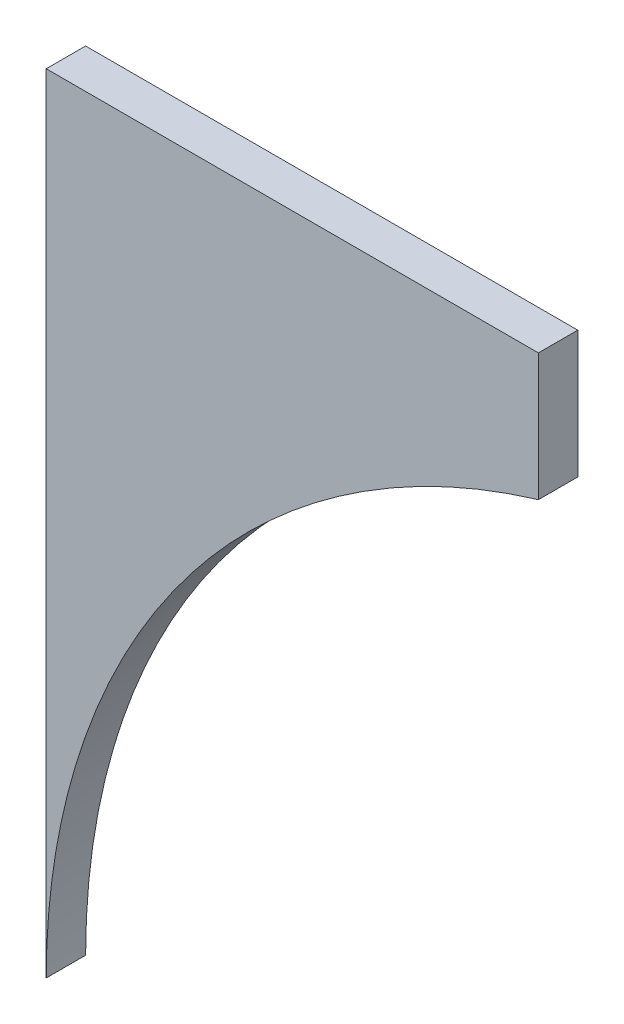
ISO-10303-21;
HEADER;
FILE_DESCRIPTION(('STEP AP214'),'2;1');
FILE_NAME('part.step','',(''),(''),'','','');
FILE_SCHEMA(('AUTOMOTIVE_DESIGN { 1 0 10303 214 1 1 1 1 }'));
ENDSEC;
DATA;
#1=APPLICATION_CONTEXT('core data for automotive mechanical design processes');
#2=APPLICATION_PROTOCOL_DEFINITION('international standard','automotive_design',2000,#1);
#3=PRODUCT_CONTEXT('',#1,'mechanical');
#4=PRODUCT('Part','Part','',(#3));
#5=PRODUCT_RELATED_PRODUCT_CATEGORY('part','',(#4));
#6=PRODUCT_DEFINITION_FORMATION('','',#4);
#7=PRODUCT_DEFINITION_CONTEXT('part definition',#1,'design');
#8=PRODUCT_DEFINITION('design','',#6,#7);
#9=PRODUCT_DEFINITION_SHAPE('','',#8);
#10=(LENGTH_UNIT() NAMED_UNIT(*) SI_UNIT(.MILLI.,.METRE.));
#11=(NAMED_UNIT(*) PLANE_ANGLE_UNIT() SI_UNIT($,.RADIAN.));
#12=(NAMED_UNIT(*) SI_UNIT($,.STERADIAN.) SOLID_ANGLE_UNIT());
#13=UNCERTAINTY_MEASURE_WITH_UNIT(LENGTH_MEASURE(1.E-05),#10,'distance_accuracy_value','');
#14=(GEOMETRIC_REPRESENTATION_CONTEXT(3) GLOBAL_UNCERTAINTY_ASSIGNED_CONTEXT((#13)) GLOBAL_UNIT_ASSIGNED_CONTEXT((#10,
#11,#12)) REPRESENTATION_CONTEXT('',''));
#15=CARTESIAN_POINT('',(0.,0.,0.));
#16=DIRECTION('',(0.,0.,1.));
#17=DIRECTION('',(1.,0.,0.));
#18=AXIS2_PLACEMENT_3D('',#15,#16,#17);
#19=CARTESIAN_POINT('',(2.09999999961,9.36458980412,0.3));
#20=DIRECTION('',(-1.,0.,0.));
#21=DIRECTION('',(0.,-1.,0.));
#22=AXIS2_PLACEMENT_3D('',#19,#20,#21);
#23=PLANE('',#22);
#24=DIRECTION('',(0.,0.,1.));
#25=VECTOR('',#24,1.);
#26=CARTESIAN_POINT('',(2.09999999961,10.0354101974,0.31));
#27=LINE('',#26,#25);
#28=CARTESIAN_POINT('',(2.09999999961,10.0354101974,0.3));
#29=VERTEX_POINT('',#28);
#30=CARTESIAN_POINT('',(2.09999999961,10.0354101974,0.32));
#31=VERTEX_POINT('',#30);
#32=EDGE_CURVE('E11',#29,#31,#27,.T.);
#33=ORIENTED_EDGE('',*,*,#32,.F.);
#34=DIRECTION('',(0.,-1.,0.));
#35=VECTOR('',#34,1.);
#36=CARTESIAN_POINT('',(2.09999999961,10.0677050991,0.3));
#37=LINE('',#36,#35);
#38=CARTESIAN_POINT('',(2.09999999961,10.1000000007,0.3));
#39=VERTEX_POINT('',#38);
#40=EDGE_CURVE('E25',#39,#29,#37,.T.);
#41=ORIENTED_EDGE('',*,*,#40,.F.);
#42=DIRECTION('',(0.,0.,1.));
#43=VECTOR('',#42,1.);
#44=CARTESIAN_POINT('',(2.09999999961,10.1000000007,0.31));
#45=LINE('',#44,#43);
#46=CARTESIAN_POINT('',(2.09999999961,10.1000000007,0.32));
#47=VERTEX_POINT('',#46);
#48=EDGE_CURVE('E74',#39,#47,#45,.T.);
#49=ORIENTED_EDGE('',*,*,#48,.T.);
#50=DIRECTION('',(0.,-1.,0.));
#51=VECTOR('',#50,1.);
#52=CARTESIAN_POINT('',(2.09999999961,10.0677050991,0.32));
#53=LINE('',#52,#51);
#54=EDGE_CURVE('E125',#47,#31,#53,.T.);
#55=ORIENTED_EDGE('',*,*,#54,.T.);
#56=EDGE_LOOP('',(#33,#41,#49,#55));
#57=FACE_BOUND('',#56,.T.);
#58=ADVANCED_FACE('F17',(#57),#23,.F.);
#59=CARTESIAN_POINT('',(1.97499999961,9.35000000075,0.32));
#60=DIRECTION('',(0.,0.,1.));
#61=DIRECTION('',(-1.,0.,0.));
#62=AXIS2_PLACEMENT_3D('',#59,#60,#61);
#63=PLANE('',#62);
#64=ORIENTED_EDGE('',*,*,#54,.F.);
#65=DIRECTION('',(1.,-1.03569419707E-09,0.));
#66=VECTOR('',#65,1.);
#67=CARTESIAN_POINT('',(1.97499999961,10.1000000009,0.32));
#68=LINE('',#67,#66);
#69=CARTESIAN_POINT('',(1.84999999961,10.1000000011,0.32));
#70=VERTEX_POINT('',#69);
#71=EDGE_CURVE('E135',#70,#47,#68,.T.);
#72=ORIENTED_EDGE('',*,*,#71,.F.);
#73=DIRECTION('',(0.,1.,0.));
#74=VECTOR('',#73,1.);
#75=CARTESIAN_POINT('',(1.84999999961,9.90000000089,0.32));
#76=LINE('',#75,#74);
#77=CARTESIAN_POINT('',(1.84999999961,9.70000000075,0.32));
#78=VERTEX_POINT('',#77);
#79=EDGE_CURVE('E69',#78,#70,#76,.T.);
#80=ORIENTED_EDGE('',*,*,#79,.F.);
#81=CARTESIAN_POINT('',(2.09999999961,10.0354101974,0.32));
#82=CARTESIAN_POINT('',(1.99258114219,10.0033840817,0.32));
#83=CARTESIAN_POINT('',(1.89828751291,9.92488321072,0.32));
#84=CARTESIAN_POINT('',(1.84999999961,9.81209140546,0.32));
#85=CARTESIAN_POINT('',(1.84999999961,9.70000000075,0.32));
#86=B_SPLINE_CURVE_WITH_KNOTS('',4,(#81,#82,#83,#84,#85),.UNSPECIFIED.,.F.,.F.,(5,5),(0.,1.),.UNSPECIFIED.);
#87=EDGE_CURVE('E142',#31,#78,#86,.T.);
#88=ORIENTED_EDGE('',*,*,#87,.F.);
#89=EDGE_LOOP('',(#64,#72,#80,#88));
#90=FACE_BOUND('',#89,.T.);
#91=ADVANCED_FACE('F102',(#90),#63,.T.);
#92=CARTESIAN_POINT('',(2.09999999961,10.0354101974,0.2998));
#93=CARTESIAN_POINT('',(2.09999999961,10.0354101974,0.320101));
#94=CARTESIAN_POINT('',(1.99258114219,10.0033840817,0.2998));
#95=CARTESIAN_POINT('',(1.99258114219,10.0033840817,0.320101));
#96=CARTESIAN_POINT('',(1.89828751291,9.92488321072,0.2998));
#97=CARTESIAN_POINT('',(1.89828751291,9.92488321072,0.320101));
#98=CARTESIAN_POINT('',(1.84999999961,9.81209140546,0.2998));
#99=CARTESIAN_POINT('',(1.84999999961,9.81209140546,0.320101));
#100=CARTESIAN_POINT('',(1.84999999961,9.70000000075,0.2998));
#101=CARTESIAN_POINT('',(1.84999999961,9.70000000075,0.320101));
#102=B_SPLINE_SURFACE_WITH_KNOTS('',4,1,((#92,#93),(#94,#95),(#96,#97),(#98,#99),(#100,#101)),
.UNSPECIFIED.,.F.,.F.,.F.,(5,5),(2,2),(0.,1.),(0.,0.829289215686277),.UNSPECIFIED.);
#103=CARTESIAN_POINT('',(1.84999999961,9.70000000075,0.320101));
#104=CARTESIAN_POINT('',(1.84999999961,9.70000000075,0.2998));
#105=B_SPLINE_CURVE_WITH_KNOTS('',1,(#103,#104),.UNSPECIFIED.,.F.,.F.,(2,2),(0.,
0.829289215686277),.UNSPECIFIED.);
#106=CARTESIAN_POINT('',(1.84999999961,9.70000000075,0.3));
#107=VERTEX_POINT('',#106);
#108=EDGE_CURVE('E123',#107,#78,#105,.F.);
#109=CARTESIAN_POINT('',(1.84999999961,9.70000000075,0.3));
#110=CARTESIAN_POINT('',(1.84999998140884,9.70467171044424,0.299997916131254));
#111=CARTESIAN_POINT('',(1.85009435908365,9.70934338767058,0.299995832857338));
#112=CARTESIAN_POINT('',(1.8504709694189,9.71868104129179,0.299991666309245));
#113=CARTESIAN_POINT('',(1.85075327723092,9.72334701465763,0.299989583035401));
#114=CARTESIAN_POINT('',(1.8515048973558,9.73266496323215,0.299985416477568));
#115=CARTESIAN_POINT('',(1.85197425337645,9.73731693491287,0.29998333319369));
#116=CARTESIAN_POINT('',(1.85309885425457,9.74659877703558,0.299979166618373));
#117=CARTESIAN_POINT('',(1.85375411587831,9.75122864544584,0.299977083326951));
#118=CARTESIAN_POINT('',(1.85524918155951,9.76045834362142,0.299972916735853));
#119=CARTESIAN_POINT('',(1.8560889800532,9.76505817428808,0.29997083343618));
#120=CARTESIAN_POINT('',(1.85795153294046,9.77422003364217,0.29996666682887));
#121=CARTESIAN_POINT('',(1.85897426404523,9.77878206706423,0.299964583521268));
#122=CARTESIAN_POINT('',(1.86120085798657,9.78786074113836,0.299960416898259));
#123=CARTESIAN_POINT('',(1.86240468430996,9.79237739074552,0.299958333582937));
#124=CARTESIAN_POINT('',(1.86499140632804,9.80135788004292,0.299954166944832));
#125=CARTESIAN_POINT('',(1.86637425658746,9.80582173282007,0.299952083622184));
#126=CARTESIAN_POINT('',(1.86931672630984,9.81468938530304,0.29994791696988));
#127=CARTESIAN_POINT('',(1.8708762954319,9.81909320171261,0.299945833640395));
#128=CARTESIAN_POINT('',(1.87416966515313,9.82783371278557,0.299941666975004));
#129=CARTESIAN_POINT('',(1.8759034141573,9.8321704268891,0.299939583639281));
#130=CARTESIAN_POINT('',(1.8795423687487,9.84076983952708,0.299935416962119));
#131=CARTESIAN_POINT('',(1.88144752470405,9.84503255906333,0.299933333620854));
#132=CARTESIAN_POINT('',(1.88542628158205,9.85347726390785,0.299929166933414));
#133=CARTESIAN_POINT('',(1.88749983756153,9.85765927039073,0.299927083587389));
#134=CARTESIAN_POINT('',(1.89181214665912,9.86593600585909,0.299922916891324));
#135=CARTESIAN_POINT('',(1.89405086171301,9.8700307546762,0.299920833541396));
#136=CARTESIAN_POINT('',(1.89869000546981,9.87812660706984,0.299916666838486));
#137=CARTESIAN_POINT('',(1.90109040461388,9.8821277275841,0.299914583485574));
#138=CARTESIAN_POINT('',(1.90604919798121,9.89003013119742,0.2999104167777));
#139=CARTESIAN_POINT('',(1.90860757220157,9.89393142684823,0.299908333422771));
#140=CARTESIAN_POINT('',(1.91387836266342,9.90162816407506,0.29990416671189));
#141=CARTESIAN_POINT('',(1.91659076893779,9.90542361247659,0.299902083355945));
#142=CARTESIAN_POINT('',(1.92216543654723,9.91290281391219,0.299897916644055));
#143=CARTESIAN_POINT('',(1.92502769788228,9.91658656694627,0.299895833288111));
#144=CARTESIAN_POINT('',(1.93089765531252,9.92383671148282,0.299891666577229));
#145=CARTESIAN_POINT('',(1.93390536079644,9.92740309538382,0.2998895832223));
#146=CARTESIAN_POINT('',(1.94006155340552,9.93441301029715,0.299885416514426));
#147=CARTESIAN_POINT('',(1.94321005827434,9.93785652572662,0.299883333161514));
#148=CARTESIAN_POINT('',(1.949642964182,9.9446153867524,0.299879166458604));
#149=CARTESIAN_POINT('',(1.95292738989793,9.94793070886139,0.299877083108676));
#150=CARTESIAN_POINT('',(1.95962702007298,9.95442804025922,0.299872916412611));
#151=CARTESIAN_POINT('',(1.96304225441254,9.95761001873674,0.299870833066586));
#152=CARTESIAN_POINT('',(1.96999815276886,9.96383569334065,0.299866666379147));
#153=CARTESIAN_POINT('',(1.97353884991846,9.96687935244722,0.299864583037881));
#154=CARTESIAN_POINT('',(1.98074009341786,9.9728235917016,0.299860416360719));
#155=CARTESIAN_POINT('',(1.98440067407454,9.97572413028694,0.299858333024996));
#156=CARTESIAN_POINT('',(1.99183587283348,9.98137750426799,0.299854166359605));
#157=CARTESIAN_POINT('',(1.99561052430693,9.98413029577377,0.299852083030119));
#158=CARTESIAN_POINT('',(2.00326782170933,9.98948372319339,0.299847916377816));
#159=CARTESIAN_POINT('',(2.00715049802884,9.9920843156373,0.299845833055168));
#160=CARTESIAN_POINT('',(2.01501757082708,9.99712906384013,0.299841666417063));
#161=CARTESIAN_POINT('',(2.01900199282868,9.99957317979685,0.299839583101741));
#162=CARTESIAN_POINT('',(2.02706605129248,10.0043008647105,0.299835416478732));
#163=CARTESIAN_POINT('',(2.03114570676879,10.0065844012349,0.29983333317113));
#164=CARTESIAN_POINT('',(2.0393934946512,10.0109869874246,0.29982916656382));
#165=CARTESIAN_POINT('',(2.04356163824852,10.0131060161247,0.299827083264147));
#166=CARTESIAN_POINT('',(2.05197943342541,10.0171758163895,0.299822916673049));
#167=CARTESIAN_POINT('',(2.05622908745841,10.0191265828799,0.299820833381627));
#168=CARTESIAN_POINT('',(2.06480270004069,10.0228562594947,0.29981666680631));
#169=CARTESIAN_POINT('',(2.06912665185256,10.0246351851059,0.299814583522432));
#170=CARTESIAN_POINT('',(2.07784143171324,10.0280177448567,0.299810416964599));
#171=CARTESIAN_POINT('',(2.08223224389322,10.0296214198742,0.299808333690755));
#172=CARTESIAN_POINT('',(2.09107305304698,10.0326502321897,0.299804167142662));
#173=CARTESIAN_POINT('',(2.09552302564612,10.0340754406412,0.299802083868746));
#174=CARTESIAN_POINT('',(2.09999999961,10.0354101974,0.2998));
#175=B_SPLINE_CURVE_WITH_KNOTS('',3,(#109,#110,#111,#112,#113,#114,#115,#116,#117,#118,#119,
#120,#121,#122,#123,#124,#125,#126,#127,#128,#129,#130,#131,#132,#133,#134,#135,#136,#137,#138,
#139,#140,#141,#142,#143,#144,#145,#146,#147,#148,#149,#150,#151,#152,#153,#154,#155,#156,#157,
#158,#159,#160,#161,#162,#163,#164,#165,#166,#167,#168,#169,#170,#171,#172,#173,#174),
.UNSPECIFIED.,.F.,.F.,(4,2,2,2,2,2,2,2,2,2,2,2,2,2,2,2,2,2,2,2,2,2,2,2,2,2,2,2,2,2,2,2,4),(0.,
0.0140141314390963,0.0280338703718055,0.0420568872365183,0.0560811691964952,0.0701050283829895,
0.0841271034884824,0.0981463551839375,0.112162055820918,0.126173773875433,0.140181353593763,
0.154184890310126,0.168184701920365,0.182181297012942,0.196175340177156,0.210167615026754,
0.224158985493729,0.238150355960793,0.252142630810666,0.266136673975343,0.280133269068569,
0.294133080679655,0.308136617397078,0.322144197116682,0.336155915172692,0.350171615811399,
0.364190867508826,0.378212942616544,0.392236801805512,0.406261083768222,0.420284100635919,
0.434303839571857,0.448317971014409),.UNSPECIFIED.);
#176=EDGE_CURVE('E60',#29,#107,#175,.F.);
#177=ORIENTED_EDGE('',*,*,#108,.F.);
#178=ORIENTED_EDGE('',*,*,#176,.F.);
#179=ORIENTED_EDGE('',*,*,#32,.T.);
#180=ORIENTED_EDGE('',*,*,#87,.T.);
#181=EDGE_LOOP('',(#177,#178,#179,#180));
#182=FACE_BOUND('',#181,.T.);
#183=ADVANCED_FACE('F96',(#182),#102,.F.);
#184=CARTESIAN_POINT('',(1.29999999961,9.70000000075,0.3));
#185=DIRECTION('',(0.,0.,1.));
#186=DIRECTION('',(-1.,0.,0.));
#187=AXIS2_PLACEMENT_3D('',#184,#185,#186);
#188=PLANE('',#187);
#189=ORIENTED_EDGE('',*,*,#176,.T.);
#190=DIRECTION('',(0.,1.,0.));
#191=VECTOR('',#190,1.);
#192=CARTESIAN_POINT('',(1.84999999961,9.90000000089,0.3));
#193=LINE('',#192,#191);
#194=CARTESIAN_POINT('',(1.84999999961,10.100000001,0.3));
#195=VERTEX_POINT('',#194);
#196=EDGE_CURVE('E54',#107,#195,#193,.T.);
#197=ORIENTED_EDGE('',*,*,#196,.T.);
#198=DIRECTION('',(1.,-1.03569419707E-09,0.));
#199=VECTOR('',#198,1.);
#200=CARTESIAN_POINT('',(1.97499999961,10.1000000008,0.3));
#201=LINE('',#200,#199);
#202=EDGE_CURVE('E58',#195,#39,#201,.T.);
#203=ORIENTED_EDGE('',*,*,#202,.T.);
#204=ORIENTED_EDGE('',*,*,#40,.T.);
#205=EDGE_LOOP('',(#189,#197,#203,#204));
#206=FACE_BOUND('',#205,.T.);
#207=ADVANCED_FACE('F56',(#206),#188,.F.);
#208=CARTESIAN_POINT('',(1.84999999961,10.100000001,0.3));
#209=DIRECTION('',(-1.03569497816E-09,-1.,5.1131590429E-09));
#210=DIRECTION('',(1.,-1.03569497816E-09,0.));
#211=AXIS2_PLACEMENT_3D('',#208,#209,#210);
#212=PLANE('',#211);
#213=ORIENTED_EDGE('',*,*,#48,.F.);
#214=ORIENTED_EDGE('',*,*,#202,.F.);
#215=DIRECTION('',(0.,5.11315434437E-09,1.));
#216=VECTOR('',#215,1.);
#217=CARTESIAN_POINT('',(1.84999999961,10.100000001,0.31));
#218=LINE('',#217,#216);
#219=EDGE_CURVE('E67',#195,#70,#218,.T.);
#220=ORIENTED_EDGE('',*,*,#219,.T.);
#221=ORIENTED_EDGE('',*,*,#71,.T.);
#222=EDGE_LOOP('',(#213,#214,#220,#221));
#223=FACE_BOUND('',#222,.T.);
#224=ADVANCED_FACE('F73',(#223),#212,.F.);
#225=CARTESIAN_POINT('',(1.84999999961,9.30000000075,0.3));
#226=DIRECTION('',(1.,0.,0.));
#227=DIRECTION('',(0.,1.,0.));
#228=AXIS2_PLACEMENT_3D('',#225,#226,#227);
#229=PLANE('',#228);
#230=ORIENTED_EDGE('',*,*,#219,.F.);
#231=ORIENTED_EDGE('',*,*,#196,.F.);
#232=ORIENTED_EDGE('',*,*,#108,.T.);
#233=ORIENTED_EDGE('',*,*,#79,.T.);
#234=EDGE_LOOP('',(#230,#231,#232,#233));
#235=FACE_BOUND('',#234,.T.);
#236=ADVANCED_FACE('F68',(#235),#229,.F.);
#237=CLOSED_SHELL('',(#58,#91,#183,#207,#224,#236));
#238=MANIFOLD_SOLID_BREP('B1',#237);
#239=ADVANCED_BREP_SHAPE_REPRESENTATION('',(#18,#238),#14);
#240=SHAPE_DEFINITION_REPRESENTATION(#9,#239);
ENDSEC;
END-ISO-10303-21;
